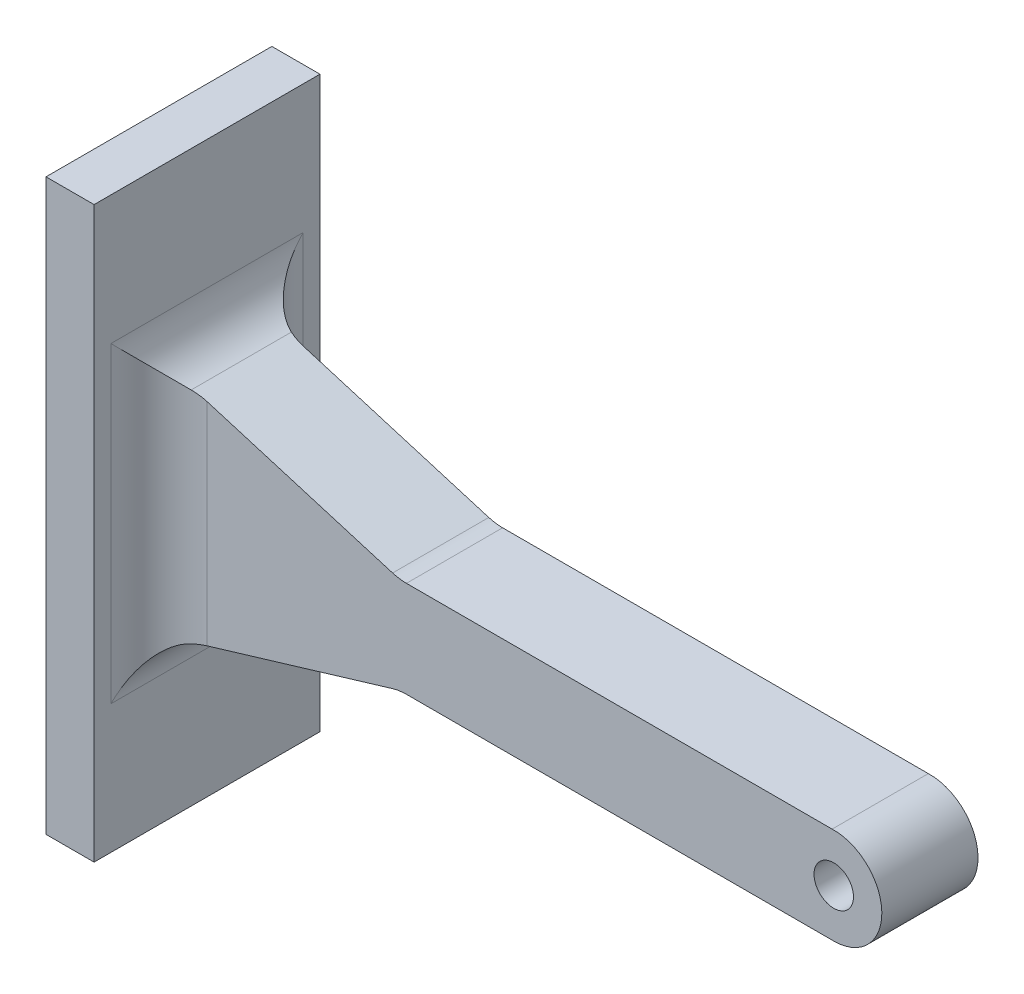
ISO-10303-21;
HEADER;
FILE_DESCRIPTION(('STEP AP214'),'2;1');
FILE_NAME('part.step','',(''),(''),'','','');
FILE_SCHEMA(('AUTOMOTIVE_DESIGN { 1 0 10303 214 1 1 1 1 }'));
ENDSEC;
DATA;
#1=APPLICATION_CONTEXT('core data for automotive mechanical design processes');
#2=APPLICATION_PROTOCOL_DEFINITION('international standard','automotive_design',2000,#1);
#3=PRODUCT_CONTEXT('',#1,'mechanical');
#4=PRODUCT('Part','Part','',(#3));
#5=PRODUCT_RELATED_PRODUCT_CATEGORY('part','',(#4));
#6=PRODUCT_DEFINITION_FORMATION('','',#4);
#7=PRODUCT_DEFINITION_CONTEXT('part definition',#1,'design');
#8=PRODUCT_DEFINITION('design','',#6,#7);
#9=PRODUCT_DEFINITION_SHAPE('','',#8);
#10=(LENGTH_UNIT() NAMED_UNIT(*) SI_UNIT(.MILLI.,.METRE.));
#11=(NAMED_UNIT(*) PLANE_ANGLE_UNIT() SI_UNIT($,.RADIAN.));
#12=(NAMED_UNIT(*) SI_UNIT($,.STERADIAN.) SOLID_ANGLE_UNIT());
#13=UNCERTAINTY_MEASURE_WITH_UNIT(LENGTH_MEASURE(1.E-05),#10,'distance_accuracy_value','');
#14=(GEOMETRIC_REPRESENTATION_CONTEXT(3) GLOBAL_UNCERTAINTY_ASSIGNED_CONTEXT((#13)) GLOBAL_UNIT_ASSIGNED_CONTEXT((#10,
#11,#12)) REPRESENTATION_CONTEXT('',''));
#15=CARTESIAN_POINT('',(0.,0.,0.));
#16=DIRECTION('',(0.,0.,1.));
#17=DIRECTION('',(1.,0.,0.));
#18=AXIS2_PLACEMENT_3D('',#15,#16,#17);
#19=CARTESIAN_POINT('',(15.,0.,5.));
#20=DIRECTION('',(0.,0.,-1.));
#21=DIRECTION('',(-1.,0.,0.));
#22=AXIS2_PLACEMENT_3D('',#19,#20,#21);
#23=CYLINDRICAL_SURFACE('',#22,2.05);
#24=CARTESIAN_POINT('',(15.,0.,5.));
#25=DIRECTION('',(0.,0.,1.));
#26=DIRECTION('',(1.,0.,0.));
#27=AXIS2_PLACEMENT_3D('',#24,#25,#26);
#28=CIRCLE('',#27,2.05);
#29=CARTESIAN_POINT('',(17.05,0.,5.));
#30=VERTEX_POINT('',#29);
#31=EDGE_CURVE('E277',#30,#30,#28,.T.);
#32=ORIENTED_EDGE('',*,*,#31,.T.);
#33=EDGE_LOOP('',(#32));
#34=FACE_BOUND('',#33,.T.);
#35=CARTESIAN_POINT('',(15.,0.,-1.));
#36=DIRECTION('',(0.,0.,-1.));
#37=DIRECTION('',(-1.,0.,0.));
#38=AXIS2_PLACEMENT_3D('',#35,#36,#37);
#39=CIRCLE('',#38,2.05);
#40=CARTESIAN_POINT('',(12.95,0.,-1.));
#41=VERTEX_POINT('',#40);
#42=EDGE_CURVE('E239',#41,#41,#39,.T.);
#43=ORIENTED_EDGE('',*,*,#42,.T.);
#44=EDGE_LOOP('',(#43));
#45=FACE_BOUND('',#44,.T.);
#46=ADVANCED_FACE('F40',(#34,#45),#23,.F.);
#47=CARTESIAN_POINT('',(15.,0.,5.));
#48=DIRECTION('',(0.,0.,1.));
#49=DIRECTION('',(1.,0.,0.));
#50=AXIS2_PLACEMENT_3D('',#47,#48,#49);
#51=PLANE('',#50);
#52=DIRECTION('',(-0.957796584042047,0.287446870912496,0.));
#53=VECTOR('',#52,1.);
#54=CARTESIAN_POINT('',(-30.167793165776,4.99718375222674,5.));
#55=LINE('',#54,#53);
#56=CARTESIAN_POINT('',(-30.8709194080466,5.2082008320165,5.));
#57=VERTEX_POINT('',#56);
#58=CARTESIAN_POINT('',(-50.167793165776,10.9994367504454,5.));
#59=VERTEX_POINT('',#58);
#60=EDGE_CURVE('E281',#57,#59,#55,.T.);
#61=ORIENTED_EDGE('',*,*,#60,.T.);
#62=DIRECTION('',(0.,-1.,0.));
#63=VECTOR('',#62,1.);
#64=CARTESIAN_POINT('',(-50.167793165776,-12.5,5.));
#65=LINE('',#64,#63);
#66=CARTESIAN_POINT('',(-50.167793165776,-10.9994367504453,5.));
#67=VERTEX_POINT('',#66);
#68=EDGE_CURVE('E336',#59,#67,#65,.T.);
#69=ORIENTED_EDGE('',*,*,#68,.T.);
#70=DIRECTION('',(0.957796584042047,0.287446870912496,0.));
#71=VECTOR('',#70,1.);
#72=CARTESIAN_POINT('',(-55.167793165776,-12.5,5.));
#73=LINE('',#72,#71);
#74=CARTESIAN_POINT('',(-30.8710719255539,-5.20824660444975,5.));
#75=VERTEX_POINT('',#74);
#76=EDGE_CURVE('E284',#67,#75,#73,.T.);
#77=ORIENTED_EDGE('',*,*,#76,.T.);
#78=CARTESIAN_POINT('',(-29.4338375709914,-9.99722952465999,5.));
#79=DIRECTION('',(0.,0.,1.));
#80=DIRECTION('',(1.,0.,0.));
#81=AXIS2_PLACEMENT_3D('',#78,#79,#80);
#82=CIRCLE('',#81,5.);
#83=CARTESIAN_POINT('',(-29.4335258170213,-4.99722953437904,5.));
#84=VERTEX_POINT('',#83);
#85=EDGE_CURVE('E346',#75,#84,#82,.F.);
#86=ORIENTED_EDGE('',*,*,#85,.T.);
#87=DIRECTION('',(0.999999998056189,-6.2350794014978E-05,0.));
#88=VECTOR('',#87,1.);
#89=CARTESIAN_POINT('',(-30.167793165776,-4.99718375222674,5.));
#90=LINE('',#89,#88);
#91=CARTESIAN_POINT('',(15.,-5.,5.));
#92=VERTEX_POINT('',#91);
#93=EDGE_CURVE('E288',#84,#92,#90,.T.);
#94=ORIENTED_EDGE('',*,*,#93,.T.);
#95=CARTESIAN_POINT('',(15.,0.,5.));
#96=DIRECTION('',(0.,0.,1.));
#97=DIRECTION('',(1.,0.,0.));
#98=AXIS2_PLACEMENT_3D('',#95,#96,#97);
#99=CIRCLE('',#98,5.);
#100=CARTESIAN_POINT('',(14.832206834224,4.99718375222674,5.));
#101=VERTEX_POINT('',#100);
#102=EDGE_CURVE('E290',#92,#101,#99,.T.);
#103=ORIENTED_EDGE('',*,*,#102,.T.);
#104=DIRECTION('',(-1.,0.,0.));
#105=VECTOR('',#104,1.);
#106=CARTESIAN_POINT('',(-30.167793165776,4.99718375222674,5.));
#107=LINE('',#106,#105);
#108=CARTESIAN_POINT('',(-29.4336850534842,4.99718375222674,5.));
#109=VERTEX_POINT('',#108);
#110=EDGE_CURVE('E292',#101,#109,#107,.T.);
#111=ORIENTED_EDGE('',*,*,#110,.T.);
#112=CARTESIAN_POINT('',(-29.4336850534842,9.99718375222674,5.));
#113=DIRECTION('',(0.,0.,1.));
#114=DIRECTION('',(1.,0.,0.));
#115=AXIS2_PLACEMENT_3D('',#112,#113,#114);
#116=CIRCLE('',#115,5.);
#117=EDGE_CURVE('E342',#109,#57,#116,.F.);
#118=ORIENTED_EDGE('',*,*,#117,.T.);
#119=EDGE_LOOP('',(#61,#69,#77,#86,#94,#103,#111,#118));
#120=FACE_BOUND('',#119,.T.);
#121=ORIENTED_EDGE('',*,*,#31,.F.);
#122=EDGE_LOOP('',(#121));
#123=FACE_BOUND('',#122,.T.);
#124=ADVANCED_FACE('F401',(#120,#123),#51,.T.);
#125=CARTESIAN_POINT('',(15.,0.,-5.));
#126=DIRECTION('',(0.,0.,1.));
#127=DIRECTION('',(1.,0.,0.));
#128=AXIS2_PLACEMENT_3D('',#125,#126,#127);
#129=PLANE('',#128);
#130=DIRECTION('',(-0.996701279874038,-0.0811576163859858,0.));
#131=VECTOR('',#130,1.);
#132=CARTESIAN_POINT('',(16.6386966544817,-2.67583411338614,-5.));
#133=LINE('',#132,#131);
#134=CARTESIAN_POINT('',(16.6386966544817,-2.67583411338614,-5.));
#135=VERTEX_POINT('',#134);
#136=CARTESIAN_POINT('',(13.416200441955,-2.93822979472266,-5.));
#137=VERTEX_POINT('',#136);
#138=EDGE_CURVE('E227',#135,#137,#133,.T.);
#139=ORIENTED_EDGE('',*,*,#138,.F.);
#140=DIRECTION('',(-0.428066082436163,-0.903747436548373,0.));
#141=VECTOR('',#140,1.);
#142=CARTESIAN_POINT('',(18.0227034348643,0.246127310929438,-5.));
#143=LINE('',#142,#141);
#144=CARTESIAN_POINT('',(18.0227034348643,0.246127310929438,-5.));
#145=VERTEX_POINT('',#144);
#146=EDGE_CURVE('E195',#145,#135,#143,.T.);
#147=ORIENTED_EDGE('',*,*,#146,.F.);
#148=DIRECTION('',(0.568635197437875,-0.822589820162387,0.));
#149=VECTOR('',#148,1.);
#150=CARTESIAN_POINT('',(16.1842140027202,2.90569305390848,-5.));
#151=LINE('',#150,#149);
#152=CARTESIAN_POINT('',(16.1842140027202,2.90569305390848,-5.));
#153=VERTEX_POINT('',#152);
#154=EDGE_CURVE('E213',#153,#145,#151,.T.);
#155=ORIENTED_EDGE('',*,*,#154,.F.);
#156=DIRECTION('',(0.996701279874038,0.0811576163859855,0.));
#157=VECTOR('',#156,1.);
#158=CARTESIAN_POINT('',(12.9617177901934,2.64329737257195,-5.));
#159=LINE('',#158,#157);
#160=CARTESIAN_POINT('',(12.9617177901934,2.64329737257195,-5.));
#161=VERTEX_POINT('',#160);
#162=EDGE_CURVE('E216',#161,#153,#159,.T.);
#163=ORIENTED_EDGE('',*,*,#162,.F.);
#164=DIRECTION('',(0.428066082436163,0.903747436548373,0.));
#165=VECTOR('',#164,1.);
#166=CARTESIAN_POINT('',(11.5777110098108,-0.278664051743626,-5.));
#167=LINE('',#166,#165);
#168=CARTESIAN_POINT('',(11.5777110098108,-0.278664051743626,-5.));
#169=VERTEX_POINT('',#168);
#170=EDGE_CURVE('E232',#169,#161,#167,.T.);
#171=ORIENTED_EDGE('',*,*,#170,.F.);
#172=DIRECTION('',(-0.568635197437875,0.822589820162387,0.));
#173=VECTOR('',#172,1.);
#174=CARTESIAN_POINT('',(13.416200441955,-2.93822979472266,-5.));
#175=LINE('',#174,#173);
#176=EDGE_CURVE('E229',#137,#169,#175,.T.);
#177=ORIENTED_EDGE('',*,*,#176,.F.);
#178=EDGE_LOOP('',(#139,#147,#155,#163,#171,#177));
#179=FACE_BOUND('',#178,.T.);
#180=DIRECTION('',(0.957796584042047,0.287446870912496,0.));
#181=VECTOR('',#180,1.);
#182=CARTESIAN_POINT('',(-55.167793165776,-12.5,-5.));
#183=LINE('',#182,#181);
#184=CARTESIAN_POINT('',(-50.167793165776,-10.9994367504453,-5.));
#185=VERTEX_POINT('',#184);
#186=CARTESIAN_POINT('',(-30.8710719255539,-5.20824660444975,-5.));
#187=VERTEX_POINT('',#186);
#188=EDGE_CURVE('E298',#185,#187,#183,.T.);
#189=ORIENTED_EDGE('',*,*,#188,.F.);
#190=DIRECTION('',(0.,-1.,0.));
#191=VECTOR('',#190,1.);
#192=CARTESIAN_POINT('',(-50.167793165776,0.,-5.));
#193=LINE('',#192,#191);
#194=CARTESIAN_POINT('',(-50.167793165776,10.9994367504453,-5.));
#195=VERTEX_POINT('',#194);
#196=EDGE_CURVE('E338',#185,#195,#193,.F.);
#197=ORIENTED_EDGE('',*,*,#196,.T.);
#198=DIRECTION('',(-0.957796584042047,0.287446870912496,0.));
#199=VECTOR('',#198,1.);
#200=CARTESIAN_POINT('',(-30.167793165776,4.99718375222674,-5.));
#201=LINE('',#200,#199);
#202=CARTESIAN_POINT('',(-30.8709194080466,5.2082008320165,-5.));
#203=VERTEX_POINT('',#202);
#204=EDGE_CURVE('E280',#203,#195,#201,.T.);
#205=ORIENTED_EDGE('',*,*,#204,.F.);
#206=CARTESIAN_POINT('',(-29.4336850534842,9.99718375222674,-5.));
#207=DIRECTION('',(0.,0.,1.));
#208=DIRECTION('',(1.,0.,0.));
#209=AXIS2_PLACEMENT_3D('',#206,#207,#208);
#210=CIRCLE('',#209,5.);
#211=CARTESIAN_POINT('',(-29.4336850534842,4.99718375222674,-5.));
#212=VERTEX_POINT('',#211);
#213=EDGE_CURVE('E340',#203,#212,#210,.T.);
#214=ORIENTED_EDGE('',*,*,#213,.T.);
#215=DIRECTION('',(-1.,0.,0.));
#216=VECTOR('',#215,1.);
#217=CARTESIAN_POINT('',(-30.167793165776,4.99718375222674,-5.));
#218=LINE('',#217,#216);
#219=CARTESIAN_POINT('',(14.832206834224,4.99718375222674,-5.));
#220=VERTEX_POINT('',#219);
#221=EDGE_CURVE('E285',#220,#212,#218,.T.);
#222=ORIENTED_EDGE('',*,*,#221,.F.);
#223=CARTESIAN_POINT('',(15.,0.,-5.));
#224=DIRECTION('',(0.,0.,1.));
#225=DIRECTION('',(1.,0.,0.));
#226=AXIS2_PLACEMENT_3D('',#223,#224,#225);
#227=CIRCLE('',#226,5.);
#228=CARTESIAN_POINT('',(15.,-5.,-5.));
#229=VERTEX_POINT('',#228);
#230=EDGE_CURVE('E303',#229,#220,#227,.T.);
#231=ORIENTED_EDGE('',*,*,#230,.F.);
#232=DIRECTION('',(0.999999998056189,-6.2350794014978E-05,0.));
#233=VECTOR('',#232,1.);
#234=CARTESIAN_POINT('',(-30.167793165776,-4.99718375222674,-5.));
#235=LINE('',#234,#233);
#236=CARTESIAN_POINT('',(-29.4335258170213,-4.99722953437904,-5.));
#237=VERTEX_POINT('',#236);
#238=EDGE_CURVE('E301',#237,#229,#235,.T.);
#239=ORIENTED_EDGE('',*,*,#238,.F.);
#240=CARTESIAN_POINT('',(-29.4338375709914,-9.99722952465999,-5.));
#241=DIRECTION('',(0.,0.,1.));
#242=DIRECTION('',(1.,0.,0.));
#243=AXIS2_PLACEMENT_3D('',#240,#241,#242);
#244=CIRCLE('',#243,5.);
#245=EDGE_CURVE('E344',#237,#187,#244,.T.);
#246=ORIENTED_EDGE('',*,*,#245,.T.);
#247=EDGE_LOOP('',(#189,#197,#205,#214,#222,#231,#239,#246));
#248=FACE_BOUND('',#247,.T.);
#249=ADVANCED_FACE('F388',(#179,#248),#129,.F.);
#250=CARTESIAN_POINT('',(-30.167793165776,4.99718375222674,5.));
#251=DIRECTION('',(-0.287446870912496,-0.957796584042047,0.));
#252=DIRECTION('',(0.957796584042047,-0.287446870912496,0.));
#253=AXIS2_PLACEMENT_3D('',#250,#251,#252);
#254=PLANE('',#253);
#255=ORIENTED_EDGE('',*,*,#204,.T.);
#256=CARTESIAN_POINT('',(-50.167793165776,10.9994367504453,-10.));
#257=DIRECTION('',(-0.287446870912496,-0.957796584042047,0.));
#258=DIRECTION('',(0.957796584042047,-0.287446870912496,0.));
#259=AXIS2_PLACEMENT_3D('',#256,#257,#258);
#260=ELLIPSE('',#259,5.22031513090101,5.);
#261=CARTESIAN_POINT('',(-51.6050275203385,11.4307689611361,-5.21101707978976));
#262=VERTEX_POINT('',#261);
#263=EDGE_CURVE('E11',#195,#262,#260,.T.);
#264=ORIENTED_EDGE('',*,*,#263,.T.);
#265=DIRECTION('',(0.,0.,-1.));
#266=VECTOR('',#265,1.);
#267=CARTESIAN_POINT('',(-51.6050275203385,11.4307689611361,5.));
#268=LINE('',#267,#266);
#269=CARTESIAN_POINT('',(-51.6050275203385,11.4307689611361,5.21101707978976));
#270=VERTEX_POINT('',#269);
#271=EDGE_CURVE('E56',#262,#270,#268,.F.);
#272=ORIENTED_EDGE('',*,*,#271,.T.);
#273=CARTESIAN_POINT('',(-50.167793165776,10.9994367504454,10.));
#274=DIRECTION('',(-0.287446870912496,-0.957796584042047,0.));
#275=DIRECTION('',(-0.957796584042047,0.287446870912496,0.));
#276=AXIS2_PLACEMENT_3D('',#273,#274,#275);
#277=ELLIPSE('',#276,5.22031513090101,5.);
#278=EDGE_CURVE('E351',#270,#59,#277,.T.);
#279=ORIENTED_EDGE('',*,*,#278,.T.);
#280=ORIENTED_EDGE('',*,*,#60,.F.);
#281=DIRECTION('',(0.,0.,-1.));
#282=VECTOR('',#281,1.);
#283=CARTESIAN_POINT('',(-30.8709194080466,5.2082008320165,-5.));
#284=LINE('',#283,#282);
#285=EDGE_CURVE('E327',#57,#203,#284,.T.);
#286=ORIENTED_EDGE('',*,*,#285,.T.);
#287=EDGE_LOOP('',(#255,#264,#272,#279,#280,#286));
#288=FACE_BOUND('',#287,.T.);
#289=ADVANCED_FACE('F408',(#288),#254,.F.);
#290=CARTESIAN_POINT('',(-55.167793165776,-12.5,5.));
#291=DIRECTION('',(-0.287446870912496,0.957796584042047,0.));
#292=DIRECTION('',(-0.957796584042047,-0.287446870912496,0.));
#293=AXIS2_PLACEMENT_3D('',#290,#291,#292);
#294=PLANE('',#293);
#295=ORIENTED_EDGE('',*,*,#76,.F.);
#296=CARTESIAN_POINT('',(-50.167793165776,-10.9994367504454,10.));
#297=DIRECTION('',(-0.287446870912496,0.957796584042047,0.));
#298=DIRECTION('',(0.957796584042047,0.287446870912496,0.));
#299=AXIS2_PLACEMENT_3D('',#296,#297,#298);
#300=ELLIPSE('',#299,5.22031513090101,5.);
#301=CARTESIAN_POINT('',(-51.6050275203385,-11.4307689611361,5.21101707978976));
#302=VERTEX_POINT('',#301);
#303=EDGE_CURVE('E348',#67,#302,#300,.T.);
#304=ORIENTED_EDGE('',*,*,#303,.T.);
#305=DIRECTION('',(0.,0.,-1.));
#306=VECTOR('',#305,1.);
#307=CARTESIAN_POINT('',(-51.6050275203385,-11.4307689611361,5.));
#308=LINE('',#307,#306);
#309=CARTESIAN_POINT('',(-51.6050275203385,-11.4307689611361,-5.21101707978976));
#310=VERTEX_POINT('',#309);
#311=EDGE_CURVE('E316',#302,#310,#308,.T.);
#312=ORIENTED_EDGE('',*,*,#311,.T.);
#313=CARTESIAN_POINT('',(-50.167793165776,-10.9994367504453,-10.));
#314=DIRECTION('',(-0.287446870912496,0.957796584042047,0.));
#315=DIRECTION('',(-0.957796584042047,-0.287446870912496,0.));
#316=AXIS2_PLACEMENT_3D('',#313,#314,#315);
#317=ELLIPSE('',#316,5.22031513090101,5.);
#318=EDGE_CURVE('E49',#310,#185,#317,.T.);
#319=ORIENTED_EDGE('',*,*,#318,.T.);
#320=ORIENTED_EDGE('',*,*,#188,.T.);
#321=DIRECTION('',(0.,0.,-1.));
#322=VECTOR('',#321,1.);
#323=CARTESIAN_POINT('',(-30.8710719255539,-5.20824660444975,5.));
#324=LINE('',#323,#322);
#325=EDGE_CURVE('E312',#187,#75,#324,.F.);
#326=ORIENTED_EDGE('',*,*,#325,.T.);
#327=EDGE_LOOP('',(#295,#304,#312,#319,#320,#326));
#328=FACE_BOUND('',#327,.T.);
#329=ADVANCED_FACE('F385',(#328),#294,.F.);
#330=CARTESIAN_POINT('',(-30.167793165776,-4.99718375222674,5.));
#331=DIRECTION('',(6.2350794014978E-05,0.999999998056189,0.));
#332=DIRECTION('',(-0.999999998056189,6.2350794014978E-05,0.));
#333=AXIS2_PLACEMENT_3D('',#330,#331,#332);
#334=PLANE('',#333);
#335=ORIENTED_EDGE('',*,*,#93,.F.);
#336=DIRECTION('',(0.,0.,-1.));
#337=VECTOR('',#336,1.);
#338=CARTESIAN_POINT('',(-29.4335258170213,-4.99722953437904,-5.));
#339=LINE('',#338,#337);
#340=EDGE_CURVE('E333',#84,#237,#339,.T.);
#341=ORIENTED_EDGE('',*,*,#340,.T.);
#342=ORIENTED_EDGE('',*,*,#238,.T.);
#343=DIRECTION('',(0.,0.,-1.));
#344=VECTOR('',#343,1.);
#345=CARTESIAN_POINT('',(15.,-5.,5.));
#346=LINE('',#345,#344);
#347=EDGE_CURVE('E309',#92,#229,#346,.T.);
#348=ORIENTED_EDGE('',*,*,#347,.F.);
#349=EDGE_LOOP('',(#335,#341,#342,#348));
#350=FACE_BOUND('',#349,.T.);
#351=ADVANCED_FACE('F397',(#350),#334,.F.);
#352=CARTESIAN_POINT('',(15.,0.,5.));
#353=DIRECTION('',(0.,0.,-1.));
#354=DIRECTION('',(-1.,0.,0.));
#355=AXIS2_PLACEMENT_3D('',#352,#353,#354);
#356=CYLINDRICAL_SURFACE('',#355,5.);
#357=ORIENTED_EDGE('',*,*,#230,.T.);
#358=DIRECTION('',(0.,0.,-1.));
#359=VECTOR('',#358,1.);
#360=CARTESIAN_POINT('',(14.832206834224,4.99718375222674,5.));
#361=LINE('',#360,#359);
#362=EDGE_CURVE('E295',#101,#220,#361,.T.);
#363=ORIENTED_EDGE('',*,*,#362,.F.);
#364=ORIENTED_EDGE('',*,*,#102,.F.);
#365=ORIENTED_EDGE('',*,*,#347,.T.);
#366=EDGE_LOOP('',(#357,#363,#364,#365));
#367=FACE_BOUND('',#366,.T.);
#368=ADVANCED_FACE('F417',(#367),#356,.T.);
#369=CARTESIAN_POINT('',(-30.167793165776,4.99718375222674,5.));
#370=DIRECTION('',(0.,-1.,0.));
#371=DIRECTION('',(1.,0.,0.));
#372=AXIS2_PLACEMENT_3D('',#369,#370,#371);
#373=PLANE('',#372);
#374=ORIENTED_EDGE('',*,*,#221,.T.);
#375=DIRECTION('',(0.,0.,-1.));
#376=VECTOR('',#375,1.);
#377=CARTESIAN_POINT('',(-29.4336850534842,4.99718375222674,5.));
#378=LINE('',#377,#376);
#379=EDGE_CURVE('E331',#212,#109,#378,.F.);
#380=ORIENTED_EDGE('',*,*,#379,.T.);
#381=ORIENTED_EDGE('',*,*,#110,.F.);
#382=ORIENTED_EDGE('',*,*,#362,.T.);
#383=EDGE_LOOP('',(#374,#380,#381,#382));
#384=FACE_BOUND('',#383,.T.);
#385=ADVANCED_FACE('F414',(#384),#373,.F.);
#386=CARTESIAN_POINT('',(-60.167793165776,-29.6071602208212,11.7429243069924));
#387=DIRECTION('',(0.,0.,-1.));
#388=DIRECTION('',(-1.,0.,0.));
#389=AXIS2_PLACEMENT_3D('',#386,#387,#388);
#390=PLANE('',#389);
#391=DIRECTION('',(0.,1.,0.));
#392=VECTOR('',#391,1.);
#393=CARTESIAN_POINT('',(-55.167793165776,-29.6071602208212,11.7429243069924));
#394=LINE('',#393,#392);
#395=CARTESIAN_POINT('',(-55.167793165776,-29.6071602208212,11.7429243069924));
#396=VERTEX_POINT('',#395);
#397=CARTESIAN_POINT('',(-55.167793165776,29.6071602208212,11.7429243069924));
#398=VERTEX_POINT('',#397);
#399=EDGE_CURVE('E258',#396,#398,#394,.T.);
#400=ORIENTED_EDGE('',*,*,#399,.T.);
#401=DIRECTION('',(1.,0.,0.));
#402=VECTOR('',#401,1.);
#403=CARTESIAN_POINT('',(-60.167793165776,29.6071602208212,11.7429243069924));
#404=LINE('',#403,#402);
#405=CARTESIAN_POINT('',(-60.167793165776,29.6071602208212,11.7429243069924));
#406=VERTEX_POINT('',#405);
#407=EDGE_CURVE('E274',#406,#398,#404,.T.);
#408=ORIENTED_EDGE('',*,*,#407,.F.);
#409=DIRECTION('',(0.,1.,0.));
#410=VECTOR('',#409,1.);
#411=CARTESIAN_POINT('',(-60.167793165776,-29.6071602208212,11.7429243069924));
#412=LINE('',#411,#410);
#413=CARTESIAN_POINT('',(-60.167793165776,-29.6071602208212,11.7429243069924));
#414=VERTEX_POINT('',#413);
#415=EDGE_CURVE('E247',#414,#406,#412,.T.);
#416=ORIENTED_EDGE('',*,*,#415,.F.);
#417=DIRECTION('',(1.,0.,0.));
#418=VECTOR('',#417,1.);
#419=CARTESIAN_POINT('',(-60.167793165776,-29.6071602208212,11.7429243069924));
#420=LINE('',#419,#418);
#421=EDGE_CURVE('E257',#414,#396,#420,.T.);
#422=ORIENTED_EDGE('',*,*,#421,.T.);
#423=EDGE_LOOP('',(#400,#408,#416,#422));
#424=FACE_BOUND('',#423,.T.);
#425=ADVANCED_FACE('F424',(#424),#390,.F.);
#426=CARTESIAN_POINT('',(-60.167793165776,29.6071602208212,-11.7429243069924));
#427=DIRECTION('',(0.,-1.,0.));
#428=DIRECTION('',(0.,0.,-1.));
#429=AXIS2_PLACEMENT_3D('',#426,#427,#428);
#430=PLANE('',#429);
#431=DIRECTION('',(0.,0.,-1.));
#432=VECTOR('',#431,1.);
#433=CARTESIAN_POINT('',(-55.167793165776,29.6071602208212,-11.7429243069924));
#434=LINE('',#433,#432);
#435=CARTESIAN_POINT('',(-55.167793165776,29.6071602208212,-11.7429243069924));
#436=VERTEX_POINT('',#435);
#437=EDGE_CURVE('E261',#398,#436,#434,.T.);
#438=ORIENTED_EDGE('',*,*,#437,.T.);
#439=DIRECTION('',(1.,0.,0.));
#440=VECTOR('',#439,1.);
#441=CARTESIAN_POINT('',(-60.167793165776,29.6071602208212,-11.7429243069924));
#442=LINE('',#441,#440);
#443=CARTESIAN_POINT('',(-60.167793165776,29.6071602208212,-11.7429243069924));
#444=VERTEX_POINT('',#443);
#445=EDGE_CURVE('E271',#444,#436,#442,.T.);
#446=ORIENTED_EDGE('',*,*,#445,.F.);
#447=DIRECTION('',(0.,0.,-1.));
#448=VECTOR('',#447,1.);
#449=CARTESIAN_POINT('',(-60.167793165776,29.6071602208212,-11.7429243069924));
#450=LINE('',#449,#448);
#451=EDGE_CURVE('E250',#406,#444,#450,.T.);
#452=ORIENTED_EDGE('',*,*,#451,.F.);
#453=ORIENTED_EDGE('',*,*,#407,.T.);
#454=EDGE_LOOP('',(#438,#446,#452,#453));
#455=FACE_BOUND('',#454,.T.);
#456=ADVANCED_FACE('F486',(#455),#430,.F.);
#457=CARTESIAN_POINT('',(-60.167793165776,-29.6071602208212,-11.7429243069924));
#458=DIRECTION('',(0.,0.,1.));
#459=DIRECTION('',(1.,0.,0.));
#460=AXIS2_PLACEMENT_3D('',#457,#458,#459);
#461=PLANE('',#460);
#462=DIRECTION('',(0.,-1.,0.));
#463=VECTOR('',#462,1.);
#464=CARTESIAN_POINT('',(-55.167793165776,-29.6071602208212,-11.7429243069924));
#465=LINE('',#464,#463);
#466=CARTESIAN_POINT('',(-55.167793165776,-29.6071602208212,-11.7429243069924));
#467=VERTEX_POINT('',#466);
#468=EDGE_CURVE('E263',#436,#467,#465,.T.);
#469=ORIENTED_EDGE('',*,*,#468,.T.);
#470=DIRECTION('',(1.,0.,0.));
#471=VECTOR('',#470,1.);
#472=CARTESIAN_POINT('',(-60.167793165776,-29.6071602208212,-11.7429243069924));
#473=LINE('',#472,#471);
#474=CARTESIAN_POINT('',(-60.167793165776,-29.6071602208212,-11.7429243069924));
#475=VERTEX_POINT('',#474);
#476=EDGE_CURVE('E268',#475,#467,#473,.T.);
#477=ORIENTED_EDGE('',*,*,#476,.F.);
#478=DIRECTION('',(0.,-1.,0.));
#479=VECTOR('',#478,1.);
#480=CARTESIAN_POINT('',(-60.167793165776,-29.6071602208212,-11.7429243069924));
#481=LINE('',#480,#479);
#482=EDGE_CURVE('E253',#444,#475,#481,.T.);
#483=ORIENTED_EDGE('',*,*,#482,.F.);
#484=ORIENTED_EDGE('',*,*,#445,.T.);
#485=EDGE_LOOP('',(#469,#477,#483,#484));
#486=FACE_BOUND('',#485,.T.);
#487=ADVANCED_FACE('F483',(#486),#461,.F.);
#488=CARTESIAN_POINT('',(-60.167793165776,-29.6071602208212,-11.7429243069924));
#489=DIRECTION('',(0.,1.,0.));
#490=DIRECTION('',(0.,0.,1.));
#491=AXIS2_PLACEMENT_3D('',#488,#489,#490);
#492=PLANE('',#491);
#493=DIRECTION('',(0.,0.,1.));
#494=VECTOR('',#493,1.);
#495=CARTESIAN_POINT('',(-55.167793165776,-29.6071602208212,-11.7429243069924));
#496=LINE('',#495,#494);
#497=EDGE_CURVE('E251',#467,#396,#496,.T.);
#498=ORIENTED_EDGE('',*,*,#497,.T.);
#499=ORIENTED_EDGE('',*,*,#421,.F.);
#500=DIRECTION('',(0.,0.,1.));
#501=VECTOR('',#500,1.);
#502=CARTESIAN_POINT('',(-60.167793165776,-29.6071602208212,-11.7429243069924));
#503=LINE('',#502,#501);
#504=EDGE_CURVE('E255',#475,#414,#503,.T.);
#505=ORIENTED_EDGE('',*,*,#504,.F.);
#506=ORIENTED_EDGE('',*,*,#476,.T.);
#507=EDGE_LOOP('',(#498,#499,#505,#506));
#508=FACE_BOUND('',#507,.T.);
#509=ADVANCED_FACE('F477',(#508),#492,.F.);
#510=CARTESIAN_POINT('',(-60.167793165776,0.,0.));
#511=DIRECTION('',(1.,0.,0.));
#512=DIRECTION('',(0.,0.,-1.));
#513=AXIS2_PLACEMENT_3D('',#510,#511,#512);
#514=PLANE('',#513);
#515=ORIENTED_EDGE('',*,*,#415,.T.);
#516=ORIENTED_EDGE('',*,*,#451,.T.);
#517=ORIENTED_EDGE('',*,*,#482,.T.);
#518=ORIENTED_EDGE('',*,*,#504,.T.);
#519=EDGE_LOOP('',(#515,#516,#517,#518));
#520=FACE_BOUND('',#519,.T.);
#521=ADVANCED_FACE('F474',(#520),#514,.F.);
#522=CARTESIAN_POINT('',(-55.167793165776,0.,0.));
#523=DIRECTION('',(1.,0.,0.));
#524=DIRECTION('',(0.,0.,-1.));
#525=AXIS2_PLACEMENT_3D('',#522,#523,#524);
#526=PLANE('',#525);
#527=DIRECTION('',(0.,0.,-1.));
#528=VECTOR('',#527,1.);
#529=CARTESIAN_POINT('',(-55.167793165776,-16.2197518813464,0.));
#530=LINE('',#529,#528);
#531=CARTESIAN_POINT('',(-55.167793165776,-16.2197518813464,-10.));
#532=VERTEX_POINT('',#531);
#533=CARTESIAN_POINT('',(-55.167793165776,-16.2197518813464,10.));
#534=VERTEX_POINT('',#533);
#535=EDGE_CURVE('E322',#532,#534,#530,.F.);
#536=ORIENTED_EDGE('',*,*,#535,.T.);
#537=DIRECTION('',(0.,-1.,0.));
#538=VECTOR('',#537,1.);
#539=CARTESIAN_POINT('',(-55.167793165776,12.5,10.));
#540=LINE('',#539,#538);
#541=CARTESIAN_POINT('',(-55.167793165776,16.2197518813464,10.));
#542=VERTEX_POINT('',#541);
#543=EDGE_CURVE('E325',#534,#542,#540,.F.);
#544=ORIENTED_EDGE('',*,*,#543,.T.);
#545=DIRECTION('',(0.,0.,-1.));
#546=VECTOR('',#545,1.);
#547=CARTESIAN_POINT('',(-55.167793165776,16.2197518813464,0.));
#548=LINE('',#547,#546);
#549=CARTESIAN_POINT('',(-55.167793165776,16.2197518813464,-10.));
#550=VERTEX_POINT('',#549);
#551=EDGE_CURVE('E320',#542,#550,#548,.T.);
#552=ORIENTED_EDGE('',*,*,#551,.T.);
#553=DIRECTION('',(0.,-1.,0.));
#554=VECTOR('',#553,1.);
#555=CARTESIAN_POINT('',(-55.167793165776,0.,-10.));
#556=LINE('',#555,#554);
#557=EDGE_CURVE('E318',#550,#532,#556,.T.);
#558=ORIENTED_EDGE('',*,*,#557,.T.);
#559=EDGE_LOOP('',(#536,#544,#552,#558));
#560=FACE_BOUND('',#559,.T.);
#561=ORIENTED_EDGE('',*,*,#399,.F.);
#562=ORIENTED_EDGE('',*,*,#497,.F.);
#563=ORIENTED_EDGE('',*,*,#468,.F.);
#564=ORIENTED_EDGE('',*,*,#437,.F.);
#565=EDGE_LOOP('',(#561,#562,#563,#564));
#566=FACE_BOUND('',#565,.T.);
#567=ADVANCED_FACE('F373',(#560,#566),#526,.T.);
#568=CARTESIAN_POINT('',(18.0227034348643,0.246127310929438,-1.));
#569=DIRECTION('',(0.903747436548373,-0.428066082436163,0.));
#570=DIRECTION('',(0.428066082436163,0.903747436548373,0.));
#571=AXIS2_PLACEMENT_3D('',#568,#569,#570);
#572=PLANE('',#571);
#573=ORIENTED_EDGE('',*,*,#146,.T.);
#574=DIRECTION('',(0.,0.,-1.));
#575=VECTOR('',#574,1.);
#576=CARTESIAN_POINT('',(16.6386966544817,-2.67583411338614,-1.));
#577=LINE('',#576,#575);
#578=CARTESIAN_POINT('',(16.6386966544817,-2.67583411338614,-1.));
#579=VERTEX_POINT('',#578);
#580=EDGE_CURVE('E188',#579,#135,#577,.T.);
#581=ORIENTED_EDGE('',*,*,#580,.F.);
#582=DIRECTION('',(-0.428066082436163,-0.903747436548373,0.));
#583=VECTOR('',#582,1.);
#584=CARTESIAN_POINT('',(18.0227034348643,0.246127310929438,-1.));
#585=LINE('',#584,#583);
#586=CARTESIAN_POINT('',(18.0227034348643,0.246127310929438,-1.));
#587=VERTEX_POINT('',#586);
#588=EDGE_CURVE('E192',#587,#579,#585,.T.);
#589=ORIENTED_EDGE('',*,*,#588,.F.);
#590=DIRECTION('',(0.,0.,-1.));
#591=VECTOR('',#590,1.);
#592=CARTESIAN_POINT('',(18.0227034348643,0.246127310929438,-1.));
#593=LINE('',#592,#591);
#594=EDGE_CURVE('E237',#587,#145,#593,.T.);
#595=ORIENTED_EDGE('',*,*,#594,.T.);
#596=EDGE_LOOP('',(#573,#581,#589,#595));
#597=FACE_BOUND('',#596,.T.);
#598=ADVANCED_FACE('F190',(#597),#572,.F.);
#599=CARTESIAN_POINT('',(16.1842140027202,2.90569305390848,-1.));
#600=DIRECTION('',(0.822589820162388,0.568635197437875,0.));
#601=DIRECTION('',(-0.568635197437875,0.822589820162388,0.));
#602=AXIS2_PLACEMENT_3D('',#599,#600,#601);
#603=PLANE('',#602);
#604=ORIENTED_EDGE('',*,*,#154,.T.);
#605=ORIENTED_EDGE('',*,*,#594,.F.);
#606=DIRECTION('',(0.568635197437875,-0.822589820162387,0.));
#607=VECTOR('',#606,1.);
#608=CARTESIAN_POINT('',(16.1842140027202,2.90569305390848,-1.));
#609=LINE('',#608,#607);
#610=CARTESIAN_POINT('',(16.1842140027202,2.90569305390848,-1.));
#611=VERTEX_POINT('',#610);
#612=EDGE_CURVE('E200',#611,#587,#609,.T.);
#613=ORIENTED_EDGE('',*,*,#612,.F.);
#614=DIRECTION('',(0.,0.,-1.));
#615=VECTOR('',#614,1.);
#616=CARTESIAN_POINT('',(16.1842140027202,2.90569305390848,-1.));
#617=LINE('',#616,#615);
#618=EDGE_CURVE('E240',#611,#153,#617,.T.);
#619=ORIENTED_EDGE('',*,*,#618,.T.);
#620=EDGE_LOOP('',(#604,#605,#613,#619));
#621=FACE_BOUND('',#620,.T.);
#622=ADVANCED_FACE('F457',(#621),#603,.F.);
#623=CARTESIAN_POINT('',(12.9617177901934,2.64329737257195,-1.));
#624=DIRECTION('',(-0.0811576163859855,0.996701279874038,0.));
#625=DIRECTION('',(-0.996701279874038,-0.0811576163859855,0.));
#626=AXIS2_PLACEMENT_3D('',#623,#624,#625);
#627=PLANE('',#626);
#628=ORIENTED_EDGE('',*,*,#162,.T.);
#629=ORIENTED_EDGE('',*,*,#618,.F.);
#630=DIRECTION('',(0.996701279874038,0.0811576163859855,0.));
#631=VECTOR('',#630,1.);
#632=CARTESIAN_POINT('',(12.9617177901934,2.64329737257195,-1.));
#633=LINE('',#632,#631);
#634=CARTESIAN_POINT('',(12.9617177901934,2.64329737257195,-1.));
#635=VERTEX_POINT('',#634);
#636=EDGE_CURVE('E223',#635,#611,#633,.T.);
#637=ORIENTED_EDGE('',*,*,#636,.F.);
#638=DIRECTION('',(0.,0.,-1.));
#639=VECTOR('',#638,1.);
#640=CARTESIAN_POINT('',(12.9617177901934,2.64329737257195,-1.));
#641=LINE('',#640,#639);
#642=EDGE_CURVE('E242',#635,#161,#641,.T.);
#643=ORIENTED_EDGE('',*,*,#642,.T.);
#644=EDGE_LOOP('',(#628,#629,#637,#643));
#645=FACE_BOUND('',#644,.T.);
#646=ADVANCED_FACE('F455',(#645),#627,.F.);
#647=CARTESIAN_POINT('',(11.5777110098108,-0.278664051743626,-1.));
#648=DIRECTION('',(-0.903747436548373,0.428066082436163,0.));
#649=DIRECTION('',(-0.428066082436163,-0.903747436548373,0.));
#650=AXIS2_PLACEMENT_3D('',#647,#648,#649);
#651=PLANE('',#650);
#652=ORIENTED_EDGE('',*,*,#170,.T.);
#653=ORIENTED_EDGE('',*,*,#642,.F.);
#654=DIRECTION('',(0.428066082436163,0.903747436548373,0.));
#655=VECTOR('',#654,1.);
#656=CARTESIAN_POINT('',(11.5777110098108,-0.278664051743626,-1.));
#657=LINE('',#656,#655);
#658=CARTESIAN_POINT('',(11.5777110098108,-0.278664051743626,-1.));
#659=VERTEX_POINT('',#658);
#660=EDGE_CURVE('E220',#659,#635,#657,.T.);
#661=ORIENTED_EDGE('',*,*,#660,.F.);
#662=DIRECTION('',(0.,0.,-1.));
#663=VECTOR('',#662,1.);
#664=CARTESIAN_POINT('',(11.5777110098108,-0.278664051743626,-1.));
#665=LINE('',#664,#663);
#666=EDGE_CURVE('E244',#659,#169,#665,.T.);
#667=ORIENTED_EDGE('',*,*,#666,.T.);
#668=EDGE_LOOP('',(#652,#653,#661,#667));
#669=FACE_BOUND('',#668,.T.);
#670=ADVANCED_FACE('F453',(#669),#651,.F.);
#671=CARTESIAN_POINT('',(13.416200441955,-2.93822979472266,-1.));
#672=DIRECTION('',(-0.822589820162387,-0.568635197437875,0.));
#673=DIRECTION('',(0.568635197437875,-0.822589820162387,0.));
#674=AXIS2_PLACEMENT_3D('',#671,#672,#673);
#675=PLANE('',#674);
#676=ORIENTED_EDGE('',*,*,#176,.T.);
#677=ORIENTED_EDGE('',*,*,#666,.F.);
#678=DIRECTION('',(-0.568635197437875,0.822589820162387,0.));
#679=VECTOR('',#678,1.);
#680=CARTESIAN_POINT('',(13.416200441955,-2.93822979472266,-1.));
#681=LINE('',#680,#679);
#682=CARTESIAN_POINT('',(13.416200441955,-2.93822979472266,-1.));
#683=VERTEX_POINT('',#682);
#684=EDGE_CURVE('E208',#683,#659,#681,.T.);
#685=ORIENTED_EDGE('',*,*,#684,.F.);
#686=DIRECTION('',(0.,0.,-1.));
#687=VECTOR('',#686,1.);
#688=CARTESIAN_POINT('',(13.416200441955,-2.93822979472266,-1.));
#689=LINE('',#688,#687);
#690=EDGE_CURVE('E199',#683,#137,#689,.T.);
#691=ORIENTED_EDGE('',*,*,#690,.T.);
#692=EDGE_LOOP('',(#676,#677,#685,#691));
#693=FACE_BOUND('',#692,.T.);
#694=ADVANCED_FACE('F449',(#693),#675,.F.);
#695=CARTESIAN_POINT('',(16.6386966544817,-2.67583411338614,-1.));
#696=DIRECTION('',(0.0811576163859858,-0.996701279874038,0.));
#697=DIRECTION('',(0.996701279874038,0.0811576163859858,0.));
#698=AXIS2_PLACEMENT_3D('',#695,#696,#697);
#699=PLANE('',#698);
#700=ORIENTED_EDGE('',*,*,#138,.T.);
#701=ORIENTED_EDGE('',*,*,#690,.F.);
#702=DIRECTION('',(-0.996701279874038,-0.0811576163859858,0.));
#703=VECTOR('',#702,1.);
#704=CARTESIAN_POINT('',(16.6386966544817,-2.67583411338614,-1.));
#705=LINE('',#704,#703);
#706=EDGE_CURVE('E203',#579,#683,#705,.T.);
#707=ORIENTED_EDGE('',*,*,#706,.F.);
#708=ORIENTED_EDGE('',*,*,#580,.T.);
#709=EDGE_LOOP('',(#700,#701,#707,#708));
#710=FACE_BOUND('',#709,.T.);
#711=ADVANCED_FACE('F204',(#710),#699,.F.);
#712=CARTESIAN_POINT('',(0.,0.,-1.));
#713=DIRECTION('',(0.,0.,-1.));
#714=DIRECTION('',(-1.,0.,0.));
#715=AXIS2_PLACEMENT_3D('',#712,#713,#714);
#716=PLANE('',#715);
#717=ORIENTED_EDGE('',*,*,#42,.F.);
#718=EDGE_LOOP('',(#717));
#719=FACE_BOUND('',#718,.T.);
#720=ORIENTED_EDGE('',*,*,#588,.T.);
#721=ORIENTED_EDGE('',*,*,#706,.T.);
#722=ORIENTED_EDGE('',*,*,#684,.T.);
#723=ORIENTED_EDGE('',*,*,#660,.T.);
#724=ORIENTED_EDGE('',*,*,#636,.T.);
#725=ORIENTED_EDGE('',*,*,#612,.T.);
#726=EDGE_LOOP('',(#720,#721,#722,#723,#724,#725));
#727=FACE_BOUND('',#726,.T.);
#728=ADVANCED_FACE('F210',(#719,#727),#716,.T.);
#729=CARTESIAN_POINT('',(-50.167793165776,16.2197518813464,0.));
#730=DIRECTION('',(0.,0.,-1.));
#731=DIRECTION('',(-1.,0.,0.));
#732=AXIS2_PLACEMENT_3D('',#729,#730,#731);
#733=CYLINDRICAL_SURFACE('',#732,5.);
#734=CARTESIAN_POINT('',(-50.167793165776,16.2197518813464,-10.));
#735=DIRECTION('',(0.,-0.707106781186547,-0.707106781186547));
#736=DIRECTION('',(0.,-0.707106781186547,0.707106781186547));
#737=AXIS2_PLACEMENT_3D('',#734,#735,#736);
#738=ELLIPSE('',#737,7.07106781186547,5.);
#739=EDGE_CURVE('E358',#550,#262,#738,.F.);
#740=ORIENTED_EDGE('',*,*,#739,.F.);
#741=ORIENTED_EDGE('',*,*,#551,.F.);
#742=CARTESIAN_POINT('',(-50.167793165776,16.2197518813464,10.));
#743=DIRECTION('',(0.,0.707106781186547,-0.707106781186547));
#744=DIRECTION('',(0.,0.707106781186547,0.707106781186547));
#745=AXIS2_PLACEMENT_3D('',#742,#743,#744);
#746=ELLIPSE('',#745,7.07106781186547,5.);
#747=EDGE_CURVE('E44',#270,#542,#746,.T.);
#748=ORIENTED_EDGE('',*,*,#747,.F.);
#749=ORIENTED_EDGE('',*,*,#271,.F.);
#750=EDGE_LOOP('',(#740,#741,#748,#749));
#751=FACE_BOUND('',#750,.T.);
#752=ADVANCED_FACE('F371',(#751),#733,.F.);
#753=CARTESIAN_POINT('',(-50.167793165776,0.,10.));
#754=DIRECTION('',(0.,1.,0.));
#755=DIRECTION('',(0.,0.,1.));
#756=AXIS2_PLACEMENT_3D('',#753,#754,#755);
#757=CYLINDRICAL_SURFACE('',#756,5.);
#758=ORIENTED_EDGE('',*,*,#747,.T.);
#759=ORIENTED_EDGE('',*,*,#543,.F.);
#760=CARTESIAN_POINT('',(-50.167793165776,-16.2197518813464,10.));
#761=DIRECTION('',(0.,0.707106781186547,0.707106781186547));
#762=DIRECTION('',(0.,0.707106781186547,-0.707106781186547));
#763=AXIS2_PLACEMENT_3D('',#760,#761,#762);
#764=ELLIPSE('',#763,7.07106781186547,5.);
#765=EDGE_CURVE('E357',#302,#534,#764,.T.);
#766=ORIENTED_EDGE('',*,*,#765,.F.);
#767=ORIENTED_EDGE('',*,*,#303,.F.);
#768=ORIENTED_EDGE('',*,*,#68,.F.);
#769=ORIENTED_EDGE('',*,*,#278,.F.);
#770=EDGE_LOOP('',(#758,#759,#766,#767,#768,#769));
#771=FACE_BOUND('',#770,.T.);
#772=ADVANCED_FACE('F367',(#771),#757,.F.);
#773=CARTESIAN_POINT('',(-50.167793165776,0.,-10.));
#774=DIRECTION('',(0.,-1.,0.));
#775=DIRECTION('',(0.,0.,-1.));
#776=AXIS2_PLACEMENT_3D('',#773,#774,#775);
#777=CYLINDRICAL_SURFACE('',#776,5.);
#778=ORIENTED_EDGE('',*,*,#196,.F.);
#779=ORIENTED_EDGE('',*,*,#318,.F.);
#780=CARTESIAN_POINT('',(-50.167793165776,-16.2197518813464,-10.));
#781=DIRECTION('',(0.,-0.707106781186547,0.707106781186547));
#782=DIRECTION('',(0.,-0.707106781186547,-0.707106781186547));
#783=AXIS2_PLACEMENT_3D('',#780,#781,#782);
#784=ELLIPSE('',#783,7.07106781186547,5.);
#785=EDGE_CURVE('E354',#532,#310,#784,.F.);
#786=ORIENTED_EDGE('',*,*,#785,.F.);
#787=ORIENTED_EDGE('',*,*,#557,.F.);
#788=ORIENTED_EDGE('',*,*,#739,.T.);
#789=ORIENTED_EDGE('',*,*,#263,.F.);
#790=EDGE_LOOP('',(#778,#779,#786,#787,#788,#789));
#791=FACE_BOUND('',#790,.T.);
#792=ADVANCED_FACE('F381',(#791),#777,.F.);
#793=CARTESIAN_POINT('',(-50.167793165776,-16.2197518813464,5.));
#794=DIRECTION('',(0.,0.,-1.));
#795=DIRECTION('',(-1.,0.,0.));
#796=AXIS2_PLACEMENT_3D('',#793,#794,#795);
#797=CYLINDRICAL_SURFACE('',#796,5.);
#798=ORIENTED_EDGE('',*,*,#765,.T.);
#799=ORIENTED_EDGE('',*,*,#535,.F.);
#800=ORIENTED_EDGE('',*,*,#785,.T.);
#801=ORIENTED_EDGE('',*,*,#311,.F.);
#802=EDGE_LOOP('',(#798,#799,#800,#801));
#803=FACE_BOUND('',#802,.T.);
#804=ADVANCED_FACE('F378',(#803),#797,.F.);
#805=CARTESIAN_POINT('',(-29.4336850534842,9.99718375222674,5.));
#806=DIRECTION('',(0.,0.,1.));
#807=DIRECTION('',(1.,0.,0.));
#808=AXIS2_PLACEMENT_3D('',#805,#806,#807);
#809=CYLINDRICAL_SURFACE('',#808,5.);
#810=ORIENTED_EDGE('',*,*,#117,.F.);
#811=ORIENTED_EDGE('',*,*,#379,.F.);
#812=ORIENTED_EDGE('',*,*,#213,.F.);
#813=ORIENTED_EDGE('',*,*,#285,.F.);
#814=EDGE_LOOP('',(#810,#811,#812,#813));
#815=FACE_BOUND('',#814,.T.);
#816=ADVANCED_FACE('F410',(#815),#809,.F.);
#817=CARTESIAN_POINT('',(-29.4338375709914,-9.99722952465999,5.));
#818=DIRECTION('',(0.,0.,1.));
#819=DIRECTION('',(1.,0.,0.));
#820=AXIS2_PLACEMENT_3D('',#817,#818,#819);
#821=CYLINDRICAL_SURFACE('',#820,5.);
#822=ORIENTED_EDGE('',*,*,#85,.F.);
#823=ORIENTED_EDGE('',*,*,#325,.F.);
#824=ORIENTED_EDGE('',*,*,#245,.F.);
#825=ORIENTED_EDGE('',*,*,#340,.F.);
#826=EDGE_LOOP('',(#822,#823,#824,#825));
#827=FACE_BOUND('',#826,.T.);
#828=ADVANCED_FACE('F42',(#827),#821,.F.);
#829=CLOSED_SHELL('',(#46,#124,#249,#289,#329,#351,#368,#385,#425,#456,#487,#509,#521,#567,#598,
#622,#646,#670,#694,#711,#728,#752,#772,#792,#804,#816,#828));
#830=MANIFOLD_SOLID_BREP('B2',#829);
#831=ADVANCED_BREP_SHAPE_REPRESENTATION('',(#18,#830),#14);
#832=SHAPE_DEFINITION_REPRESENTATION(#9,#831);
ENDSEC;
END-ISO-10303-21;
